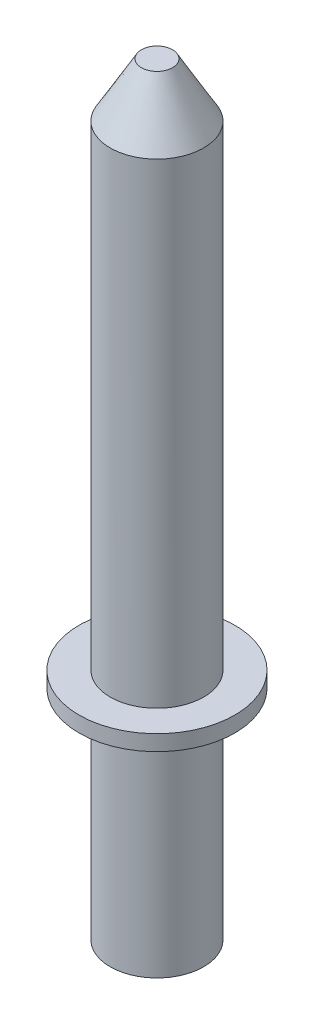
ISO-10303-21;
HEADER;
FILE_DESCRIPTION(('STEP AP214'),'2;1');
FILE_NAME('part.step','',(''),(''),'','','');
FILE_SCHEMA(('AUTOMOTIVE_DESIGN { 1 0 10303 214 1 1 1 1 }'));
ENDSEC;
DATA;
#1=APPLICATION_CONTEXT('core data for automotive mechanical design processes');
#2=APPLICATION_PROTOCOL_DEFINITION('international standard','automotive_design',2000,#1);
#3=PRODUCT_CONTEXT('',#1,'mechanical');
#4=PRODUCT('Part','Part','',(#3));
#5=PRODUCT_RELATED_PRODUCT_CATEGORY('part','',(#4));
#6=PRODUCT_DEFINITION_FORMATION('','',#4);
#7=PRODUCT_DEFINITION_CONTEXT('part definition',#1,'design');
#8=PRODUCT_DEFINITION('design','',#6,#7);
#9=PRODUCT_DEFINITION_SHAPE('','',#8);
#10=(LENGTH_UNIT() NAMED_UNIT(*) SI_UNIT(.MILLI.,.METRE.));
#11=(NAMED_UNIT(*) PLANE_ANGLE_UNIT() SI_UNIT($,.RADIAN.));
#12=(NAMED_UNIT(*) SI_UNIT($,.STERADIAN.) SOLID_ANGLE_UNIT());
#13=UNCERTAINTY_MEASURE_WITH_UNIT(LENGTH_MEASURE(1.E-05),#10,'distance_accuracy_value','');
#14=(GEOMETRIC_REPRESENTATION_CONTEXT(3) GLOBAL_UNCERTAINTY_ASSIGNED_CONTEXT((#13)) GLOBAL_UNIT_ASSIGNED_CONTEXT((#10,
#11,#12)) REPRESENTATION_CONTEXT('',''));
#15=CARTESIAN_POINT('',(0.,0.,0.));
#16=DIRECTION('',(0.,0.,1.));
#17=DIRECTION('',(1.,0.,0.));
#18=AXIS2_PLACEMENT_3D('',#15,#16,#17);
#19=CARTESIAN_POINT('',(0.,7.,0.));
#20=DIRECTION('',(0.,-1.,0.));
#21=DIRECTION('',(0.,0.,-1.));
#22=AXIS2_PLACEMENT_3D('',#19,#20,#21);
#23=CYLINDRICAL_SURFACE('',#22,1.5);
#24=CARTESIAN_POINT('',(0.,7.,0.));
#25=DIRECTION('',(0.,1.,0.));
#26=DIRECTION('',(0.,0.,1.));
#27=AXIS2_PLACEMENT_3D('',#24,#25,#26);
#28=CIRCLE('',#27,1.5);
#29=CARTESIAN_POINT('',(0.,7.,1.5));
#30=VERTEX_POINT('',#29);
#31=EDGE_CURVE('E64',#30,#30,#28,.T.);
#32=ORIENTED_EDGE('',*,*,#31,.F.);
#33=EDGE_LOOP('',(#32));
#34=FACE_BOUND('',#33,.T.);
#35=CARTESIAN_POINT('',(0.,0.,0.));
#36=DIRECTION('',(0.,1.,0.));
#37=DIRECTION('',(0.,0.,1.));
#38=AXIS2_PLACEMENT_3D('',#35,#36,#37);
#39=CIRCLE('',#38,1.5);
#40=CARTESIAN_POINT('',(0.,0.,1.5));
#41=VERTEX_POINT('',#40);
#42=EDGE_CURVE('E67',#41,#41,#39,.T.);
#43=ORIENTED_EDGE('',*,*,#42,.T.);
#44=EDGE_LOOP('',(#43));
#45=FACE_BOUND('',#44,.T.);
#46=ADVANCED_FACE('F45',(#34,#45),#23,.T.);
#47=CARTESIAN_POINT('',(0.,0.,0.));
#48=DIRECTION('',(0.,1.,0.));
#49=DIRECTION('',(0.,0.,1.));
#50=AXIS2_PLACEMENT_3D('',#47,#48,#49);
#51=PLANE('',#50);
#52=ORIENTED_EDGE('',*,*,#42,.F.);
#53=EDGE_LOOP('',(#52));
#54=FACE_BOUND('',#53,.T.);
#55=ADVANCED_FACE('F88',(#54),#51,.F.);
#56=CARTESIAN_POINT('',(0.,7.5,0.));
#57=DIRECTION('',(0.,-1.,0.));
#58=DIRECTION('',(0.,0.,-1.));
#59=AXIS2_PLACEMENT_3D('',#56,#57,#58);
#60=CYLINDRICAL_SURFACE('',#59,2.5);
#61=CARTESIAN_POINT('',(0.,7.5,0.));
#62=DIRECTION('',(0.,1.,0.));
#63=DIRECTION('',(0.,0.,1.));
#64=AXIS2_PLACEMENT_3D('',#61,#62,#63);
#65=CIRCLE('',#64,2.5);
#66=CARTESIAN_POINT('',(0.,7.5,2.5));
#67=VERTEX_POINT('',#66);
#68=EDGE_CURVE('E71',#67,#67,#65,.T.);
#69=ORIENTED_EDGE('',*,*,#68,.F.);
#70=EDGE_LOOP('',(#69));
#71=FACE_BOUND('',#70,.T.);
#72=CARTESIAN_POINT('',(0.,7.,0.));
#73=DIRECTION('',(0.,1.,0.));
#74=DIRECTION('',(0.,0.,1.));
#75=AXIS2_PLACEMENT_3D('',#72,#73,#74);
#76=CIRCLE('',#75,2.5);
#77=CARTESIAN_POINT('',(0.,7.,2.5));
#78=VERTEX_POINT('',#77);
#79=EDGE_CURVE('E75',#78,#78,#76,.T.);
#80=ORIENTED_EDGE('',*,*,#79,.T.);
#81=EDGE_LOOP('',(#80));
#82=FACE_BOUND('',#81,.T.);
#83=ADVANCED_FACE('F85',(#71,#82),#60,.T.);
#84=CARTESIAN_POINT('',(0.,7.5,0.));
#85=DIRECTION('',(0.,1.,0.));
#86=DIRECTION('',(0.,0.,1.));
#87=AXIS2_PLACEMENT_3D('',#84,#85,#86);
#88=PLANE('',#87);
#89=CARTESIAN_POINT('',(0.,7.5,0.));
#90=DIRECTION('',(0.,1.,0.));
#91=DIRECTION('',(0.,0.,1.));
#92=AXIS2_PLACEMENT_3D('',#89,#90,#91);
#93=CIRCLE('',#92,1.5);
#94=CARTESIAN_POINT('',(0.,7.5,1.5));
#95=VERTEX_POINT('',#94);
#96=EDGE_CURVE('E59',#95,#95,#93,.T.);
#97=ORIENTED_EDGE('',*,*,#96,.F.);
#98=EDGE_LOOP('',(#97));
#99=FACE_BOUND('',#98,.T.);
#100=ORIENTED_EDGE('',*,*,#68,.T.);
#101=EDGE_LOOP('',(#100));
#102=FACE_BOUND('',#101,.T.);
#103=ADVANCED_FACE('F83',(#99,#102),#88,.T.);
#104=CARTESIAN_POINT('',(0.,7.,0.));
#105=DIRECTION('',(0.,1.,0.));
#106=DIRECTION('',(0.,0.,1.));
#107=AXIS2_PLACEMENT_3D('',#104,#105,#106);
#108=PLANE('',#107);
#109=ORIENTED_EDGE('',*,*,#31,.T.);
#110=EDGE_LOOP('',(#109));
#111=FACE_BOUND('',#110,.T.);
#112=ORIENTED_EDGE('',*,*,#79,.F.);
#113=EDGE_LOOP('',(#112));
#114=FACE_BOUND('',#113,.T.);
#115=ADVANCED_FACE('F92',(#111,#114),#108,.F.);
#116=CARTESIAN_POINT('',(0.,24.5,0.));
#117=DIRECTION('',(0.,-1.,0.));
#118=DIRECTION('',(0.,0.,-1.));
#119=AXIS2_PLACEMENT_3D('',#116,#117,#118);
#120=CYLINDRICAL_SURFACE('',#119,1.5);
#121=CARTESIAN_POINT('',(0.,22.7679491924311,0.));
#122=DIRECTION('',(0.,1.,0.));
#123=DIRECTION('',(0.,0.,1.));
#124=AXIS2_PLACEMENT_3D('',#121,#122,#123);
#125=CIRCLE('',#124,1.5);
#126=CARTESIAN_POINT('',(0.,22.7679491924311,-1.5));
#127=VERTEX_POINT('',#126);
#128=EDGE_CURVE('E10',#127,#127,#125,.F.);
#129=ORIENTED_EDGE('',*,*,#128,.T.);
#130=EDGE_LOOP('',(#129));
#131=FACE_BOUND('',#130,.T.);
#132=ORIENTED_EDGE('',*,*,#96,.T.);
#133=EDGE_LOOP('',(#132));
#134=FACE_BOUND('',#133,.T.);
#135=ADVANCED_FACE('F94',(#131,#134),#120,.T.);
#136=CARTESIAN_POINT('',(0.,24.5,0.));
#137=DIRECTION('',(0.,1.,0.));
#138=DIRECTION('',(0.,0.,1.));
#139=AXIS2_PLACEMENT_3D('',#136,#137,#138);
#140=PLANE('',#139);
#141=CARTESIAN_POINT('',(0.,24.5,0.));
#142=DIRECTION('',(0.,1.,0.));
#143=DIRECTION('',(0.,0.,1.));
#144=AXIS2_PLACEMENT_3D('',#141,#142,#143);
#145=CIRCLE('',#144,0.500000000000002);
#146=CARTESIAN_POINT('',(0.,24.5,-0.500000000000003));
#147=VERTEX_POINT('',#146);
#148=EDGE_CURVE('E54',#147,#147,#145,.T.);
#149=ORIENTED_EDGE('',*,*,#148,.T.);
#150=EDGE_LOOP('',(#149));
#151=FACE_BOUND('',#150,.T.);
#152=ADVANCED_FACE('F101',(#151),#140,.T.);
#153=CARTESIAN_POINT('',(0.,24.5,0.));
#154=DIRECTION('',(0.,-1.,0.));
#155=DIRECTION('',(0.,0.,-1.));
#156=AXIS2_PLACEMENT_3D('',#153,#154,#155);
#157=CONICAL_SURFACE('',#156,0.500000000000002,0.523598775598299);
#158=CARTESIAN_POINT('',(0.,22.7679491924311,-1.5));
#159=CARTESIAN_POINT('',(0.,22.7859913883433,-1.48958333333333));
#160=CARTESIAN_POINT('',(0.,22.8040335842555,-1.47916666666667));
#161=CARTESIAN_POINT('',(0.,22.8401179760798,-1.45833333333333));
#162=CARTESIAN_POINT('',(0.,22.858160171992,-1.44791666666667));
#163=CARTESIAN_POINT('',(0.,22.8942445638164,-1.42708333333333));
#164=CARTESIAN_POINT('',(0.,22.9122867597285,-1.41666666666667));
#165=CARTESIAN_POINT('',(0.,22.9483711515529,-1.39583333333333));
#166=CARTESIAN_POINT('',(0.,22.9664133474651,-1.38541666666667));
#167=CARTESIAN_POINT('',(0.,23.0024977392894,-1.36458333333334));
#168=CARTESIAN_POINT('',(0.,23.0205399352016,-1.35416666666667));
#169=CARTESIAN_POINT('',(0.,23.0566243270259,-1.33333333333334));
#170=CARTESIAN_POINT('',(0.,23.0746665229381,-1.32291666666667));
#171=CARTESIAN_POINT('',(0.,23.1107509147625,-1.30208333333334));
#172=CARTESIAN_POINT('',(0.,23.1287931106746,-1.29166666666667));
#173=CARTESIAN_POINT('',(0.,23.164877502499,-1.27083333333334));
#174=CARTESIAN_POINT('',(0.,23.1829196984112,-1.26041666666667));
#175=CARTESIAN_POINT('',(0.,23.2190040902355,-1.23958333333334));
#176=CARTESIAN_POINT('',(0.,23.2370462861477,-1.22916666666667));
#177=CARTESIAN_POINT('',(0.,23.273130677972,-1.20833333333334));
#178=CARTESIAN_POINT('',(0.,23.2911728738842,-1.19791666666667));
#179=CARTESIAN_POINT('',(0.,23.3272572657086,-1.17708333333334));
#180=CARTESIAN_POINT('',(0.,23.3452994616208,-1.16666666666667));
#181=CARTESIAN_POINT('',(0.,23.3813838534451,-1.14583333333334));
#182=CARTESIAN_POINT('',(0.,23.3994260493573,-1.13541666666667));
#183=CARTESIAN_POINT('',(0.,23.4355104411816,-1.11458333333334));
#184=CARTESIAN_POINT('',(0.,23.4535526370938,-1.10416666666667));
#185=CARTESIAN_POINT('',(0.,23.4896370289182,-1.08333333333334));
#186=CARTESIAN_POINT('',(0.,23.5076792248303,-1.07291666666667));
#187=CARTESIAN_POINT('',(0.,23.5437636166547,-1.05208333333334));
#188=CARTESIAN_POINT('',(0.,23.5618058125669,-1.04166666666667));
#189=CARTESIAN_POINT('',(0.,23.5978902043912,-1.02083333333334));
#190=CARTESIAN_POINT('',(0.,23.6159324003034,-1.01041666666667));
#191=CARTESIAN_POINT('',(0.,23.6520167921277,-0.989583333333336));
#192=CARTESIAN_POINT('',(0.,23.6700589880399,-0.979166666666669));
#193=CARTESIAN_POINT('',(0.,23.7061433798643,-0.958333333333335));
#194=CARTESIAN_POINT('',(0.,23.7241855757764,-0.947916666666669));
#195=CARTESIAN_POINT('',(0.,23.7602699676008,-0.927083333333336));
#196=CARTESIAN_POINT('',(0.,23.778312163513,-0.916666666666669));
#197=CARTESIAN_POINT('',(0.,23.8143965553373,-0.895833333333336));
#198=CARTESIAN_POINT('',(0.,23.8324387512495,-0.885416666666669));
#199=CARTESIAN_POINT('',(0.,23.8685231430738,-0.864583333333336));
#200=CARTESIAN_POINT('',(0.,23.886565338986,-0.854166666666669));
#201=CARTESIAN_POINT('',(0.,23.9226497308104,-0.833333333333336));
#202=CARTESIAN_POINT('',(0.,23.9406919267226,-0.822916666666669));
#203=CARTESIAN_POINT('',(0.,23.9767763185469,-0.802083333333336));
#204=CARTESIAN_POINT('',(0.,23.9948185144591,-0.79166666666667));
#205=CARTESIAN_POINT('',(0.,24.0309029062834,-0.770833333333336));
#206=CARTESIAN_POINT('',(0.,24.0489451021956,-0.760416666666669));
#207=CARTESIAN_POINT('',(0.,24.08502949402,-0.739583333333336));
#208=CARTESIAN_POINT('',(0.,24.1030716899321,-0.729166666666669));
#209=CARTESIAN_POINT('',(0.,24.1391560817565,-0.708333333333336));
#210=CARTESIAN_POINT('',(0.,24.1571982776687,-0.69791666666667));
#211=CARTESIAN_POINT('',(0.,24.193282669493,-0.677083333333336));
#212=CARTESIAN_POINT('',(0.,24.2113248654052,-0.66666666666667));
#213=CARTESIAN_POINT('',(0.,24.2474092572295,-0.645833333333336));
#214=CARTESIAN_POINT('',(0.,24.2654514531417,-0.63541666666667));
#215=CARTESIAN_POINT('',(0.,24.3015358449661,-0.614583333333336));
#216=CARTESIAN_POINT('',(0.,24.3195780408782,-0.60416666666667));
#217=CARTESIAN_POINT('',(0.,24.3556624327026,-0.583333333333336));
#218=CARTESIAN_POINT('',(0.,24.3737046286148,-0.57291666666667));
#219=CARTESIAN_POINT('',(0.,24.4097890204391,-0.552083333333336));
#220=CARTESIAN_POINT('',(0.,24.4278312163513,-0.54166666666667));
#221=CARTESIAN_POINT('',(0.,24.4639156081756,-0.520833333333336));
#222=CARTESIAN_POINT('',(0.,24.4819578040878,-0.51041666666667));
#223=CARTESIAN_POINT('',(0.,24.5,-0.500000000000003));
#224=B_SPLINE_CURVE_WITH_KNOTS('',3,(#158,#159,#160,#161,#162,#163,#164,#165,#166,#167,#168,
#169,#170,#171,#172,#173,#174,#175,#176,#177,#178,#179,#180,#181,#182,#183,#184,#185,#186,#187,
#188,#189,#190,#191,#192,#193,#194,#195,#196,#197,#198,#199,#200,#201,#202,#203,#204,#205,#206,
#207,#208,#209,#210,#211,#212,#213,#214,#215,#216,#217,#218,#219,#220,#221,#222,#223),
.UNSPECIFIED.,.F.,.F.,(4,2,2,2,2,2,2,2,2,2,2,2,2,2,2,2,2,2,2,2,2,2,2,2,2,2,2,2,2,2,2,2,4),(0.,
0.0624999999999972,0.124999999999997,0.187499999999998,0.249999999999998,0.312499999999998,
0.374999999999998,0.437499999999999,0.499999999999996,0.562499999999996,0.624999999999996,
0.687499999999996,0.749999999999997,0.812499999999997,0.874999999999997,0.937499999999997,
0.999999999999997,1.06249999999999,1.12499999999999,1.1875,1.25,1.3125,1.375,1.4375,
1.49999999999999,1.56249999999999,1.62499999999999,1.68749999999999,1.74999999999999,
1.81249999999999,1.875,1.9375,2.),.UNSPECIFIED.);
#225=EDGE_CURVE('BSEAM48',#127,#147,#224,.T.);
#226=ORIENTED_EDGE('',*,*,#128,.F.);
#227=ORIENTED_EDGE('',*,*,#148,.F.);
#228=ORIENTED_EDGE('',*,*,#225,.T.);
#229=ORIENTED_EDGE('',*,*,#225,.F.);
#230=EDGE_LOOP('',(#226,#228,#227,#229));
#231=FACE_BOUND('',#230,.T.);
#232=ADVANCED_FACE('F48',(#231),#157,.T.);
#233=CLOSED_SHELL('',(#46,#55,#83,#103,#115,#135,#152,#232));
#234=MANIFOLD_SOLID_BREP('B2',#233);
#235=ADVANCED_BREP_SHAPE_REPRESENTATION('',(#18,#234),#14);
#236=SHAPE_DEFINITION_REPRESENTATION(#9,#235);
ENDSEC;
END-ISO-10303-21;
